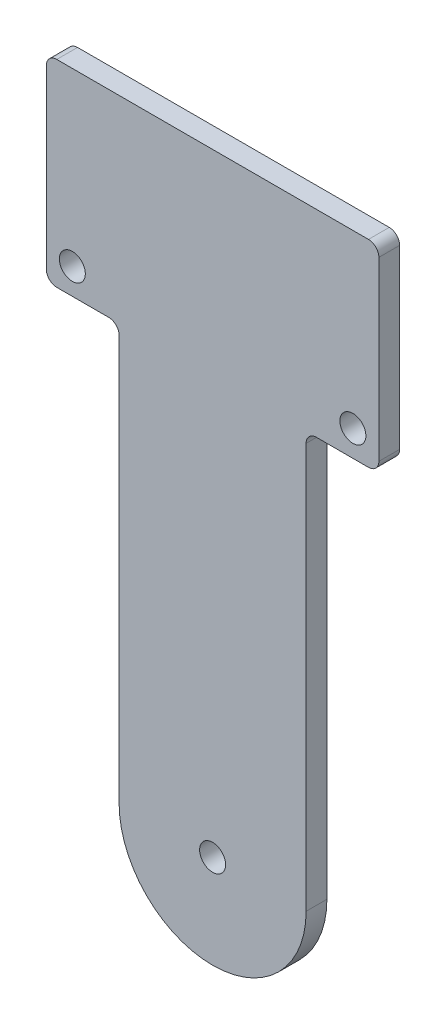
ISO-10303-21;
HEADER;
FILE_DESCRIPTION(('STEP AP214'),'2;1');
FILE_NAME('part.step','',(''),(''),'','','');
FILE_SCHEMA(('AUTOMOTIVE_DESIGN { 1 0 10303 214 1 1 1 1 }'));
ENDSEC;
DATA;
#1=APPLICATION_CONTEXT('core data for automotive mechanical design processes');
#2=APPLICATION_PROTOCOL_DEFINITION('international standard','automotive_design',2000,#1);
#3=PRODUCT_CONTEXT('',#1,'mechanical');
#4=PRODUCT('Part','Part','',(#3));
#5=PRODUCT_RELATED_PRODUCT_CATEGORY('part','',(#4));
#6=PRODUCT_DEFINITION_FORMATION('','',#4);
#7=PRODUCT_DEFINITION_CONTEXT('part definition',#1,'design');
#8=PRODUCT_DEFINITION('design','',#6,#7);
#9=PRODUCT_DEFINITION_SHAPE('','',#8);
#10=(LENGTH_UNIT() NAMED_UNIT(*) SI_UNIT(.MILLI.,.METRE.));
#11=(NAMED_UNIT(*) PLANE_ANGLE_UNIT() SI_UNIT($,.RADIAN.));
#12=(NAMED_UNIT(*) SI_UNIT($,.STERADIAN.) SOLID_ANGLE_UNIT());
#13=UNCERTAINTY_MEASURE_WITH_UNIT(LENGTH_MEASURE(1.E-05),#10,'distance_accuracy_value','');
#14=(GEOMETRIC_REPRESENTATION_CONTEXT(3) GLOBAL_UNCERTAINTY_ASSIGNED_CONTEXT((#13)) GLOBAL_UNIT_ASSIGNED_CONTEXT((#10,
#11,#12)) REPRESENTATION_CONTEXT('',''));
#15=CARTESIAN_POINT('',(0.,0.,0.));
#16=DIRECTION('',(0.,0.,1.));
#17=DIRECTION('',(1.,0.,0.));
#18=AXIS2_PLACEMENT_3D('',#15,#16,#17);
#19=CARTESIAN_POINT('',(0.,-20.404186251909,2.));
#20=DIRECTION('',(0.,-1.,0.));
#21=DIRECTION('',(0.,0.,-1.));
#22=AXIS2_PLACEMENT_3D('',#19,#20,#21);
#23=PLANE('',#22);
#24=DIRECTION('',(-1.,0.,0.));
#25=VECTOR('',#24,1.);
#26=CARTESIAN_POINT('',(0.,-20.404186251909,0.));
#27=LINE('',#26,#25);
#28=CARTESIAN_POINT('',(23.0486139328405,-20.404186251909,0.));
#29=VERTEX_POINT('',#28);
#30=CARTESIAN_POINT('',(18.0486139328405,-20.404186251909,0.));
#31=VERTEX_POINT('',#30);
#32=EDGE_CURVE('E174',#29,#31,#27,.T.);
#33=ORIENTED_EDGE('',*,*,#32,.F.);
#34=DIRECTION('',(0.,0.,-1.));
#35=VECTOR('',#34,1.);
#36=CARTESIAN_POINT('',(23.0486139328405,-20.404186251909,2.));
#37=LINE('',#36,#35);
#38=CARTESIAN_POINT('',(23.0486139328405,-20.404186251909,2.));
#39=VERTEX_POINT('',#38);
#40=EDGE_CURVE('E11',#39,#29,#37,.T.);
#41=ORIENTED_EDGE('',*,*,#40,.F.);
#42=DIRECTION('',(-1.,0.,0.));
#43=VECTOR('',#42,1.);
#44=CARTESIAN_POINT('',(0.,-20.404186251909,2.));
#45=LINE('',#44,#43);
#46=CARTESIAN_POINT('',(18.0486139328405,-20.404186251909,2.));
#47=VERTEX_POINT('',#46);
#48=EDGE_CURVE('E258',#39,#47,#45,.T.);
#49=ORIENTED_EDGE('',*,*,#48,.T.);
#50=DIRECTION('',(0.,0.,-1.));
#51=VECTOR('',#50,1.);
#52=CARTESIAN_POINT('',(18.0486139328405,-20.404186251909,2.));
#53=LINE('',#52,#51);
#54=EDGE_CURVE('E103',#47,#31,#53,.T.);
#55=ORIENTED_EDGE('',*,*,#54,.T.);
#56=EDGE_LOOP('',(#33,#41,#49,#55));
#57=FACE_BOUND('',#56,.T.);
#58=ADVANCED_FACE('F34',(#57),#23,.T.);
#59=CARTESIAN_POINT('',(23.0486139328405,-19.404186251909,2.));
#60=DIRECTION('',(0.,0.,-1.));
#61=DIRECTION('',(-1.,0.,0.));
#62=AXIS2_PLACEMENT_3D('',#59,#60,#61);
#63=CYLINDRICAL_SURFACE('',#62,1.);
#64=CARTESIAN_POINT('',(23.0486139328405,-19.404186251909,0.));
#65=DIRECTION('',(0.,0.,1.));
#66=DIRECTION('',(1.,0.,0.));
#67=AXIS2_PLACEMENT_3D('',#64,#65,#66);
#68=CIRCLE('',#67,1.);
#69=CARTESIAN_POINT('',(24.0486139328405,-19.404186251909,0.));
#70=VERTEX_POINT('',#69);
#71=EDGE_CURVE('E177',#29,#70,#68,.T.);
#72=ORIENTED_EDGE('',*,*,#71,.T.);
#73=DIRECTION('',(0.,0.,-1.));
#74=VECTOR('',#73,1.);
#75=CARTESIAN_POINT('',(24.0486139328405,-19.404186251909,2.));
#76=LINE('',#75,#74);
#77=CARTESIAN_POINT('',(24.0486139328405,-19.404186251909,2.));
#78=VERTEX_POINT('',#77);
#79=EDGE_CURVE('E43',#78,#70,#76,.T.);
#80=ORIENTED_EDGE('',*,*,#79,.F.);
#81=CARTESIAN_POINT('',(23.0486139328405,-19.404186251909,2.));
#82=DIRECTION('',(0.,0.,1.));
#83=DIRECTION('',(1.,0.,0.));
#84=AXIS2_PLACEMENT_3D('',#81,#82,#83);
#85=CIRCLE('',#84,1.);
#86=EDGE_CURVE('E254',#39,#78,#85,.T.);
#87=ORIENTED_EDGE('',*,*,#86,.F.);
#88=ORIENTED_EDGE('',*,*,#40,.T.);
#89=EDGE_LOOP('',(#72,#80,#87,#88));
#90=FACE_BOUND('',#89,.T.);
#91=ADVANCED_FACE('F242',(#90),#63,.T.);
#92=CARTESIAN_POINT('',(24.0486139328405,0.,2.));
#93=DIRECTION('',(1.,0.,0.));
#94=DIRECTION('',(0.,1.,0.));
#95=AXIS2_PLACEMENT_3D('',#92,#93,#94);
#96=PLANE('',#95);
#97=DIRECTION('',(0.,-1.,0.));
#98=VECTOR('',#97,1.);
#99=CARTESIAN_POINT('',(24.0486139328405,0.,0.));
#100=LINE('',#99,#98);
#101=CARTESIAN_POINT('',(24.0486139328405,-2.40418625190903,0.));
#102=VERTEX_POINT('',#101);
#103=EDGE_CURVE('E180',#102,#70,#100,.T.);
#104=ORIENTED_EDGE('',*,*,#103,.F.);
#105=DIRECTION('',(0.,0.,-1.));
#106=VECTOR('',#105,1.);
#107=CARTESIAN_POINT('',(24.0486139328405,-2.40418625190903,2.));
#108=LINE('',#107,#106);
#109=CARTESIAN_POINT('',(24.0486139328405,-2.40418625190903,2.));
#110=VERTEX_POINT('',#109);
#111=EDGE_CURVE('E232',#110,#102,#108,.T.);
#112=ORIENTED_EDGE('',*,*,#111,.F.);
#113=DIRECTION('',(0.,-1.,0.));
#114=VECTOR('',#113,1.);
#115=CARTESIAN_POINT('',(24.0486139328405,0.,2.));
#116=LINE('',#115,#114);
#117=EDGE_CURVE('E239',#110,#78,#116,.T.);
#118=ORIENTED_EDGE('',*,*,#117,.T.);
#119=ORIENTED_EDGE('',*,*,#79,.T.);
#120=EDGE_LOOP('',(#104,#112,#118,#119));
#121=FACE_BOUND('',#120,.T.);
#122=ADVANCED_FACE('F237',(#121),#96,.T.);
#123=CARTESIAN_POINT('',(23.0486139328405,-2.40418625190903,2.));
#124=DIRECTION('',(0.,0.,-1.));
#125=DIRECTION('',(-1.,0.,0.));
#126=AXIS2_PLACEMENT_3D('',#123,#124,#125);
#127=CYLINDRICAL_SURFACE('',#126,1.);
#128=CARTESIAN_POINT('',(23.0486139328405,-2.40418625190903,0.));
#129=DIRECTION('',(0.,0.,1.));
#130=DIRECTION('',(1.,0.,0.));
#131=AXIS2_PLACEMENT_3D('',#128,#129,#130);
#132=CIRCLE('',#131,1.);
#133=CARTESIAN_POINT('',(23.0486139328405,-1.40418625190903,0.));
#134=VERTEX_POINT('',#133);
#135=EDGE_CURVE('E183',#134,#102,#132,.F.);
#136=ORIENTED_EDGE('',*,*,#135,.F.);
#137=DIRECTION('',(0.,0.,-1.));
#138=VECTOR('',#137,1.);
#139=CARTESIAN_POINT('',(23.0486139328405,-1.40418625190903,2.));
#140=LINE('',#139,#138);
#141=CARTESIAN_POINT('',(23.0486139328405,-1.40418625190903,2.));
#142=VERTEX_POINT('',#141);
#143=EDGE_CURVE('E230',#142,#134,#140,.T.);
#144=ORIENTED_EDGE('',*,*,#143,.F.);
#145=CARTESIAN_POINT('',(23.0486139328405,-2.40418625190903,2.));
#146=DIRECTION('',(0.,0.,1.));
#147=DIRECTION('',(1.,0.,0.));
#148=AXIS2_PLACEMENT_3D('',#145,#146,#147);
#149=CIRCLE('',#148,1.);
#150=EDGE_CURVE('E252',#142,#110,#149,.F.);
#151=ORIENTED_EDGE('',*,*,#150,.T.);
#152=ORIENTED_EDGE('',*,*,#111,.T.);
#153=EDGE_LOOP('',(#136,#144,#151,#152));
#154=FACE_BOUND('',#153,.T.);
#155=ADVANCED_FACE('F248',(#154),#127,.T.);
#156=CARTESIAN_POINT('',(0.,-1.40418625190904,2.));
#157=DIRECTION('',(0.,-1.,0.));
#158=DIRECTION('',(1.,0.,0.));
#159=AXIS2_PLACEMENT_3D('',#156,#157,#158);
#160=PLANE('',#159);
#161=DIRECTION('',(-1.,0.,0.));
#162=VECTOR('',#161,1.);
#163=CARTESIAN_POINT('',(0.,-1.40418625190904,0.));
#164=LINE('',#163,#162);
#165=CARTESIAN_POINT('',(-6.95138606715951,-1.40418625190904,0.));
#166=VERTEX_POINT('',#165);
#167=EDGE_CURVE('E186',#134,#166,#164,.T.);
#168=ORIENTED_EDGE('',*,*,#167,.T.);
#169=DIRECTION('',(0.,0.,-1.));
#170=VECTOR('',#169,1.);
#171=CARTESIAN_POINT('',(-6.95138606715951,-1.40418625190904,2.));
#172=LINE('',#171,#170);
#173=CARTESIAN_POINT('',(-6.95138606715951,-1.40418625190904,2.));
#174=VERTEX_POINT('',#173);
#175=EDGE_CURVE('E227',#174,#166,#172,.T.);
#176=ORIENTED_EDGE('',*,*,#175,.F.);
#177=DIRECTION('',(-1.,0.,0.));
#178=VECTOR('',#177,1.);
#179=CARTESIAN_POINT('',(0.,-1.40418625190904,2.));
#180=LINE('',#179,#178);
#181=EDGE_CURVE('E256',#142,#174,#180,.T.);
#182=ORIENTED_EDGE('',*,*,#181,.F.);
#183=ORIENTED_EDGE('',*,*,#143,.T.);
#184=EDGE_LOOP('',(#168,#176,#182,#183));
#185=FACE_BOUND('',#184,.T.);
#186=ADVANCED_FACE('F359',(#185),#160,.F.);
#187=CARTESIAN_POINT('',(-6.95138606715951,-2.40418625190904,2.));
#188=DIRECTION('',(0.,0.,-1.));
#189=DIRECTION('',(-1.,0.,0.));
#190=AXIS2_PLACEMENT_3D('',#187,#188,#189);
#191=CYLINDRICAL_SURFACE('',#190,1.);
#192=CARTESIAN_POINT('',(-6.95138606715951,-2.40418625190904,0.));
#193=DIRECTION('',(0.,0.,1.));
#194=DIRECTION('',(1.,0.,0.));
#195=AXIS2_PLACEMENT_3D('',#192,#193,#194);
#196=CIRCLE('',#195,1.);
#197=CARTESIAN_POINT('',(-7.95138606715951,-2.40418625190904,0.));
#198=VERTEX_POINT('',#197);
#199=EDGE_CURVE('E189',#166,#198,#196,.T.);
#200=ORIENTED_EDGE('',*,*,#199,.T.);
#201=DIRECTION('',(0.,0.,-1.));
#202=VECTOR('',#201,1.);
#203=CARTESIAN_POINT('',(-7.95138606715951,-2.40418625190904,2.));
#204=LINE('',#203,#202);
#205=CARTESIAN_POINT('',(-7.95138606715951,-2.40418625190904,2.));
#206=VERTEX_POINT('',#205);
#207=EDGE_CURVE('E224',#206,#198,#204,.T.);
#208=ORIENTED_EDGE('',*,*,#207,.F.);
#209=CARTESIAN_POINT('',(-6.95138606715951,-2.40418625190904,2.));
#210=DIRECTION('',(0.,0.,1.));
#211=DIRECTION('',(1.,0.,0.));
#212=AXIS2_PLACEMENT_3D('',#209,#210,#211);
#213=CIRCLE('',#212,1.);
#214=EDGE_CURVE('E263',#174,#206,#213,.T.);
#215=ORIENTED_EDGE('',*,*,#214,.F.);
#216=ORIENTED_EDGE('',*,*,#175,.T.);
#217=EDGE_LOOP('',(#200,#208,#215,#216));
#218=FACE_BOUND('',#217,.T.);
#219=ADVANCED_FACE('F355',(#218),#191,.T.);
#220=CARTESIAN_POINT('',(-7.95138606715951,0.,2.));
#221=DIRECTION('',(1.,0.,0.));
#222=DIRECTION('',(0.,1.,0.));
#223=AXIS2_PLACEMENT_3D('',#220,#221,#222);
#224=PLANE('',#223);
#225=DIRECTION('',(0.,-1.,0.));
#226=VECTOR('',#225,1.);
#227=CARTESIAN_POINT('',(-7.95138606715951,0.,0.));
#228=LINE('',#227,#226);
#229=CARTESIAN_POINT('',(-7.95138606715951,-19.404186251909,0.));
#230=VERTEX_POINT('',#229);
#231=EDGE_CURVE('E192',#198,#230,#228,.T.);
#232=ORIENTED_EDGE('',*,*,#231,.T.);
#233=DIRECTION('',(0.,0.,-1.));
#234=VECTOR('',#233,1.);
#235=CARTESIAN_POINT('',(-7.95138606715951,-19.404186251909,2.));
#236=LINE('',#235,#234);
#237=CARTESIAN_POINT('',(-7.95138606715951,-19.404186251909,2.));
#238=VERTEX_POINT('',#237);
#239=EDGE_CURVE('E222',#238,#230,#236,.T.);
#240=ORIENTED_EDGE('',*,*,#239,.F.);
#241=DIRECTION('',(0.,-1.,0.));
#242=VECTOR('',#241,1.);
#243=CARTESIAN_POINT('',(-7.95138606715951,0.,2.));
#244=LINE('',#243,#242);
#245=EDGE_CURVE('E266',#206,#238,#244,.T.);
#246=ORIENTED_EDGE('',*,*,#245,.F.);
#247=ORIENTED_EDGE('',*,*,#207,.T.);
#248=EDGE_LOOP('',(#232,#240,#246,#247));
#249=FACE_BOUND('',#248,.T.);
#250=ADVANCED_FACE('F351',(#249),#224,.F.);
#251=CARTESIAN_POINT('',(-6.95138606715951,-19.404186251909,2.));
#252=DIRECTION('',(0.,0.,-1.));
#253=DIRECTION('',(-1.,0.,0.));
#254=AXIS2_PLACEMENT_3D('',#251,#252,#253);
#255=CYLINDRICAL_SURFACE('',#254,1.);
#256=CARTESIAN_POINT('',(-6.95138606715951,-19.404186251909,0.));
#257=DIRECTION('',(0.,0.,1.));
#258=DIRECTION('',(1.,0.,0.));
#259=AXIS2_PLACEMENT_3D('',#256,#257,#258);
#260=CIRCLE('',#259,1.);
#261=CARTESIAN_POINT('',(-6.9513860671595,-20.404186251909,0.));
#262=VERTEX_POINT('',#261);
#263=EDGE_CURVE('E195',#262,#230,#260,.F.);
#264=ORIENTED_EDGE('',*,*,#263,.F.);
#265=DIRECTION('',(0.,0.,-1.));
#266=VECTOR('',#265,1.);
#267=CARTESIAN_POINT('',(-6.9513860671595,-20.404186251909,2.));
#268=LINE('',#267,#266);
#269=CARTESIAN_POINT('',(-6.9513860671595,-20.404186251909,2.));
#270=VERTEX_POINT('',#269);
#271=EDGE_CURVE('E220',#270,#262,#268,.T.);
#272=ORIENTED_EDGE('',*,*,#271,.F.);
#273=CARTESIAN_POINT('',(-6.95138606715951,-19.404186251909,2.));
#274=DIRECTION('',(0.,0.,1.));
#275=DIRECTION('',(1.,0.,0.));
#276=AXIS2_PLACEMENT_3D('',#273,#274,#275);
#277=CIRCLE('',#276,1.);
#278=EDGE_CURVE('E268',#270,#238,#277,.F.);
#279=ORIENTED_EDGE('',*,*,#278,.T.);
#280=ORIENTED_EDGE('',*,*,#239,.T.);
#281=EDGE_LOOP('',(#264,#272,#279,#280));
#282=FACE_BOUND('',#281,.T.);
#283=ADVANCED_FACE('F347',(#282),#255,.T.);
#284=CARTESIAN_POINT('',(0.,-20.404186251909,2.));
#285=DIRECTION('',(0.,-1.,0.));
#286=DIRECTION('',(1.,0.,0.));
#287=AXIS2_PLACEMENT_3D('',#284,#285,#286);
#288=PLANE('',#287);
#289=DIRECTION('',(-1.,0.,0.));
#290=VECTOR('',#289,1.);
#291=CARTESIAN_POINT('',(0.,-20.404186251909,0.));
#292=LINE('',#291,#290);
#293=CARTESIAN_POINT('',(-1.95138606715951,-20.404186251909,0.));
#294=VERTEX_POINT('',#293);
#295=EDGE_CURVE('E198',#294,#262,#292,.T.);
#296=ORIENTED_EDGE('',*,*,#295,.F.);
#297=DIRECTION('',(0.,0.,-1.));
#298=VECTOR('',#297,1.);
#299=CARTESIAN_POINT('',(-1.95138606715951,-20.404186251909,2.));
#300=LINE('',#299,#298);
#301=CARTESIAN_POINT('',(-1.95138606715951,-20.404186251909,2.));
#302=VERTEX_POINT('',#301);
#303=EDGE_CURVE('E218',#302,#294,#300,.T.);
#304=ORIENTED_EDGE('',*,*,#303,.F.);
#305=DIRECTION('',(-1.,0.,0.));
#306=VECTOR('',#305,1.);
#307=CARTESIAN_POINT('',(0.,-20.404186251909,2.));
#308=LINE('',#307,#306);
#309=EDGE_CURVE('E271',#302,#270,#308,.T.);
#310=ORIENTED_EDGE('',*,*,#309,.T.);
#311=ORIENTED_EDGE('',*,*,#271,.T.);
#312=EDGE_LOOP('',(#296,#304,#310,#311));
#313=FACE_BOUND('',#312,.T.);
#314=ADVANCED_FACE('F343',(#313),#288,.T.);
#315=CARTESIAN_POINT('',(-1.9513860671595,-21.404186251909,2.));
#316=DIRECTION('',(0.,0.,-1.));
#317=DIRECTION('',(-1.,0.,0.));
#318=AXIS2_PLACEMENT_3D('',#315,#316,#317);
#319=CYLINDRICAL_SURFACE('',#318,1.);
#320=CARTESIAN_POINT('',(-1.9513860671595,-21.404186251909,0.));
#321=DIRECTION('',(0.,0.,1.));
#322=DIRECTION('',(1.,0.,0.));
#323=AXIS2_PLACEMENT_3D('',#320,#321,#322);
#324=CIRCLE('',#323,1.);
#325=CARTESIAN_POINT('',(-0.951386067159499,-21.404186251909,0.));
#326=VERTEX_POINT('',#325);
#327=EDGE_CURVE('E201',#326,#294,#324,.T.);
#328=ORIENTED_EDGE('',*,*,#327,.F.);
#329=DIRECTION('',(0.,0.,-1.));
#330=VECTOR('',#329,1.);
#331=CARTESIAN_POINT('',(-0.951386067159499,-21.404186251909,2.));
#332=LINE('',#331,#330);
#333=CARTESIAN_POINT('',(-0.951386067159499,-21.404186251909,2.));
#334=VERTEX_POINT('',#333);
#335=EDGE_CURVE('E216',#334,#326,#332,.T.);
#336=ORIENTED_EDGE('',*,*,#335,.F.);
#337=CARTESIAN_POINT('',(-1.9513860671595,-21.404186251909,2.));
#338=DIRECTION('',(0.,0.,1.));
#339=DIRECTION('',(1.,0.,0.));
#340=AXIS2_PLACEMENT_3D('',#337,#338,#339);
#341=CIRCLE('',#340,1.);
#342=EDGE_CURVE('E274',#334,#302,#341,.T.);
#343=ORIENTED_EDGE('',*,*,#342,.T.);
#344=ORIENTED_EDGE('',*,*,#303,.T.);
#345=EDGE_LOOP('',(#328,#336,#343,#344));
#346=FACE_BOUND('',#345,.T.);
#347=ADVANCED_FACE('F340',(#346),#319,.F.);
#348=CARTESIAN_POINT('',(-0.951386067159499,0.,2.));
#349=DIRECTION('',(-1.,0.,0.));
#350=DIRECTION('',(0.,0.,1.));
#351=AXIS2_PLACEMENT_3D('',#348,#349,#350);
#352=PLANE('',#351);
#353=DIRECTION('',(0.,1.,0.));
#354=VECTOR('',#353,1.);
#355=CARTESIAN_POINT('',(-0.951386067159499,0.,0.));
#356=LINE('',#355,#354);
#357=CARTESIAN_POINT('',(-0.951386067159499,-60.404186251909,0.));
#358=VERTEX_POINT('',#357);
#359=EDGE_CURVE('E204',#358,#326,#356,.T.);
#360=ORIENTED_EDGE('',*,*,#359,.F.);
#361=DIRECTION('',(0.,0.,-1.));
#362=VECTOR('',#361,1.);
#363=CARTESIAN_POINT('',(-0.951386067159499,-60.404186251909,2.));
#364=LINE('',#363,#362);
#365=CARTESIAN_POINT('',(-0.951386067159499,-60.404186251909,2.));
#366=VERTEX_POINT('',#365);
#367=EDGE_CURVE('E151',#366,#358,#364,.T.);
#368=ORIENTED_EDGE('',*,*,#367,.F.);
#369=DIRECTION('',(0.,1.,0.));
#370=VECTOR('',#369,1.);
#371=CARTESIAN_POINT('',(-0.951386067159499,0.,2.));
#372=LINE('',#371,#370);
#373=EDGE_CURVE('E158',#366,#334,#372,.T.);
#374=ORIENTED_EDGE('',*,*,#373,.T.);
#375=ORIENTED_EDGE('',*,*,#335,.T.);
#376=EDGE_LOOP('',(#360,#368,#374,#375));
#377=FACE_BOUND('',#376,.T.);
#378=ADVANCED_FACE('F278',(#377),#352,.T.);
#379=CARTESIAN_POINT('',(8.0486139328405,-60.404186251909,2.));
#380=DIRECTION('',(0.,0.,-1.));
#381=DIRECTION('',(-1.,0.,0.));
#382=AXIS2_PLACEMENT_3D('',#379,#380,#381);
#383=CYLINDRICAL_SURFACE('',#382,9.);
#384=CARTESIAN_POINT('',(8.0486139328405,-60.404186251909,0.));
#385=DIRECTION('',(0.,0.,1.));
#386=DIRECTION('',(1.,0.,0.));
#387=AXIS2_PLACEMENT_3D('',#384,#385,#386);
#388=CIRCLE('',#387,9.);
#389=CARTESIAN_POINT('',(17.0486139328405,-60.404186251909,0.));
#390=VERTEX_POINT('',#389);
#391=EDGE_CURVE('E146',#390,#358,#388,.F.);
#392=ORIENTED_EDGE('',*,*,#391,.F.);
#393=DIRECTION('',(0.,0.,-1.));
#394=VECTOR('',#393,1.);
#395=CARTESIAN_POINT('',(17.0486139328405,-60.404186251909,2.));
#396=LINE('',#395,#394);
#397=CARTESIAN_POINT('',(17.0486139328405,-60.404186251909,2.));
#398=VERTEX_POINT('',#397);
#399=EDGE_CURVE('E141',#398,#390,#396,.T.);
#400=ORIENTED_EDGE('',*,*,#399,.F.);
#401=CARTESIAN_POINT('',(8.0486139328405,-60.404186251909,2.));
#402=DIRECTION('',(0.,0.,1.));
#403=DIRECTION('',(1.,0.,0.));
#404=AXIS2_PLACEMENT_3D('',#401,#402,#403);
#405=CIRCLE('',#404,9.);
#406=EDGE_CURVE('E144',#398,#366,#405,.F.);
#407=ORIENTED_EDGE('',*,*,#406,.T.);
#408=ORIENTED_EDGE('',*,*,#367,.T.);
#409=EDGE_LOOP('',(#392,#400,#407,#408));
#410=FACE_BOUND('',#409,.T.);
#411=ADVANCED_FACE('F143',(#410),#383,.T.);
#412=CARTESIAN_POINT('',(17.0486139328405,0.,2.));
#413=DIRECTION('',(1.,0.,0.));
#414=DIRECTION('',(0.,0.,-1.));
#415=AXIS2_PLACEMENT_3D('',#412,#413,#414);
#416=PLANE('',#415);
#417=DIRECTION('',(0.,-1.,0.));
#418=VECTOR('',#417,1.);
#419=CARTESIAN_POINT('',(17.0486139328405,0.,0.));
#420=LINE('',#419,#418);
#421=CARTESIAN_POINT('',(17.0486139328405,-21.404186251909,0.));
#422=VERTEX_POINT('',#421);
#423=EDGE_CURVE('E208',#422,#390,#420,.T.);
#424=ORIENTED_EDGE('',*,*,#423,.F.);
#425=DIRECTION('',(0.,0.,-1.));
#426=VECTOR('',#425,1.);
#427=CARTESIAN_POINT('',(17.0486139328405,-21.404186251909,2.));
#428=LINE('',#427,#426);
#429=CARTESIAN_POINT('',(17.0486139328405,-21.404186251909,2.));
#430=VERTEX_POINT('',#429);
#431=EDGE_CURVE('E96',#430,#422,#428,.T.);
#432=ORIENTED_EDGE('',*,*,#431,.F.);
#433=DIRECTION('',(0.,-1.,0.));
#434=VECTOR('',#433,1.);
#435=CARTESIAN_POINT('',(17.0486139328405,0.,2.));
#436=LINE('',#435,#434);
#437=EDGE_CURVE('E155',#430,#398,#436,.T.);
#438=ORIENTED_EDGE('',*,*,#437,.T.);
#439=ORIENTED_EDGE('',*,*,#399,.T.);
#440=EDGE_LOOP('',(#424,#432,#438,#439));
#441=FACE_BOUND('',#440,.T.);
#442=ADVANCED_FACE('F160',(#441),#416,.T.);
#443=CARTESIAN_POINT('',(21.5486139328405,-17.904186251909,2.));
#444=DIRECTION('',(0.,0.,-1.));
#445=DIRECTION('',(-1.,0.,0.));
#446=AXIS2_PLACEMENT_3D('',#443,#444,#445);
#447=CYLINDRICAL_SURFACE('',#446,1.25);
#448=CARTESIAN_POINT('',(21.5486139328405,-17.904186251909,2.));
#449=DIRECTION('',(0.,0.,1.));
#450=DIRECTION('',(1.,0.,0.));
#451=AXIS2_PLACEMENT_3D('',#448,#449,#450);
#452=CIRCLE('',#451,1.25);
#453=CARTESIAN_POINT('',(22.7986139328405,-17.904186251909,2.));
#454=VERTEX_POINT('',#453);
#455=EDGE_CURVE('E281',#454,#454,#452,.T.);
#456=ORIENTED_EDGE('',*,*,#455,.T.);
#457=EDGE_LOOP('',(#456));
#458=FACE_BOUND('',#457,.T.);
#459=CARTESIAN_POINT('',(21.5486139328405,-17.904186251909,0.));
#460=DIRECTION('',(0.,0.,1.));
#461=DIRECTION('',(1.,0.,0.));
#462=AXIS2_PLACEMENT_3D('',#459,#460,#461);
#463=CIRCLE('',#462,1.25);
#464=CARTESIAN_POINT('',(22.7986139328405,-17.904186251909,0.));
#465=VERTEX_POINT('',#464);
#466=EDGE_CURVE('E171',#465,#465,#463,.T.);
#467=ORIENTED_EDGE('',*,*,#466,.F.);
#468=EDGE_LOOP('',(#467));
#469=FACE_BOUND('',#468,.T.);
#470=ADVANCED_FACE('F300',(#458,#469),#447,.F.);
#471=CARTESIAN_POINT('',(-5.4513860671595,-17.904186251909,2.));
#472=DIRECTION('',(0.,0.,-1.));
#473=DIRECTION('',(-1.,0.,0.));
#474=AXIS2_PLACEMENT_3D('',#471,#472,#473);
#475=CYLINDRICAL_SURFACE('',#474,1.25);
#476=CARTESIAN_POINT('',(-5.4513860671595,-17.904186251909,2.));
#477=DIRECTION('',(0.,0.,1.));
#478=DIRECTION('',(1.,0.,0.));
#479=AXIS2_PLACEMENT_3D('',#476,#477,#478);
#480=CIRCLE('',#479,1.25);
#481=CARTESIAN_POINT('',(-4.2013860671595,-17.904186251909,2.));
#482=VERTEX_POINT('',#481);
#483=EDGE_CURVE('E283',#482,#482,#480,.T.);
#484=ORIENTED_EDGE('',*,*,#483,.T.);
#485=EDGE_LOOP('',(#484));
#486=FACE_BOUND('',#485,.T.);
#487=CARTESIAN_POINT('',(-5.4513860671595,-17.904186251909,0.));
#488=DIRECTION('',(0.,0.,1.));
#489=DIRECTION('',(1.,0.,0.));
#490=AXIS2_PLACEMENT_3D('',#487,#488,#489);
#491=CIRCLE('',#490,1.25);
#492=CARTESIAN_POINT('',(-4.2013860671595,-17.904186251909,0.));
#493=VERTEX_POINT('',#492);
#494=EDGE_CURVE('E168',#493,#493,#491,.T.);
#495=ORIENTED_EDGE('',*,*,#494,.F.);
#496=EDGE_LOOP('',(#495));
#497=FACE_BOUND('',#496,.T.);
#498=ADVANCED_FACE('F303',(#486,#497),#475,.F.);
#499=CARTESIAN_POINT('',(8.0486139328405,-60.404186251909,2.));
#500=DIRECTION('',(0.,0.,-1.));
#501=DIRECTION('',(-1.,0.,0.));
#502=AXIS2_PLACEMENT_3D('',#499,#500,#501);
#503=CYLINDRICAL_SURFACE('',#502,1.25);
#504=CARTESIAN_POINT('',(8.0486139328405,-60.404186251909,2.));
#505=DIRECTION('',(0.,0.,1.));
#506=DIRECTION('',(1.,0.,0.));
#507=AXIS2_PLACEMENT_3D('',#504,#505,#506);
#508=CIRCLE('',#507,1.25);
#509=CARTESIAN_POINT('',(9.2986139328405,-60.404186251909,2.));
#510=VERTEX_POINT('',#509);
#511=EDGE_CURVE('E212',#510,#510,#508,.T.);
#512=ORIENTED_EDGE('',*,*,#511,.T.);
#513=EDGE_LOOP('',(#512));
#514=FACE_BOUND('',#513,.T.);
#515=CARTESIAN_POINT('',(8.0486139328405,-60.404186251909,0.));
#516=DIRECTION('',(0.,0.,1.));
#517=DIRECTION('',(1.,0.,0.));
#518=AXIS2_PLACEMENT_3D('',#515,#516,#517);
#519=CIRCLE('',#518,1.25);
#520=CARTESIAN_POINT('',(9.2986139328405,-60.404186251909,0.));
#521=VERTEX_POINT('',#520);
#522=EDGE_CURVE('E165',#521,#521,#519,.T.);
#523=ORIENTED_EDGE('',*,*,#522,.F.);
#524=EDGE_LOOP('',(#523));
#525=FACE_BOUND('',#524,.T.);
#526=ADVANCED_FACE('F36',(#514,#525),#503,.F.);
#527=CARTESIAN_POINT('',(18.0486139328405,-21.404186251909,2.));
#528=DIRECTION('',(0.,0.,-1.));
#529=DIRECTION('',(-1.,0.,0.));
#530=AXIS2_PLACEMENT_3D('',#527,#528,#529);
#531=CYLINDRICAL_SURFACE('',#530,1.);
#532=CARTESIAN_POINT('',(18.0486139328405,-21.404186251909,0.));
#533=DIRECTION('',(0.,0.,1.));
#534=DIRECTION('',(1.,0.,0.));
#535=AXIS2_PLACEMENT_3D('',#532,#533,#534);
#536=CIRCLE('',#535,1.);
#537=EDGE_CURVE('E210',#422,#31,#536,.F.);
#538=ORIENTED_EDGE('',*,*,#537,.T.);
#539=ORIENTED_EDGE('',*,*,#54,.F.);
#540=CARTESIAN_POINT('',(18.0486139328405,-21.404186251909,2.));
#541=DIRECTION('',(0.,0.,1.));
#542=DIRECTION('',(1.,0.,0.));
#543=AXIS2_PLACEMENT_3D('',#540,#541,#542);
#544=CIRCLE('',#543,1.);
#545=EDGE_CURVE('E51',#430,#47,#544,.F.);
#546=ORIENTED_EDGE('',*,*,#545,.F.);
#547=ORIENTED_EDGE('',*,*,#431,.T.);
#548=EDGE_LOOP('',(#538,#539,#546,#547));
#549=FACE_BOUND('',#548,.T.);
#550=ADVANCED_FACE('F280',(#549),#531,.F.);
#551=CARTESIAN_POINT('',(0.,0.,2.));
#552=DIRECTION('',(0.,0.,1.));
#553=DIRECTION('',(1.,0.,0.));
#554=AXIS2_PLACEMENT_3D('',#551,#552,#553);
#555=PLANE('',#554);
#556=ORIENTED_EDGE('',*,*,#511,.F.);
#557=EDGE_LOOP('',(#556));
#558=FACE_BOUND('',#557,.T.);
#559=ORIENTED_EDGE('',*,*,#483,.F.);
#560=EDGE_LOOP('',(#559));
#561=FACE_BOUND('',#560,.T.);
#562=ORIENTED_EDGE('',*,*,#455,.F.);
#563=EDGE_LOOP('',(#562));
#564=FACE_BOUND('',#563,.T.);
#565=ORIENTED_EDGE('',*,*,#48,.F.);
#566=ORIENTED_EDGE('',*,*,#86,.T.);
#567=ORIENTED_EDGE('',*,*,#117,.F.);
#568=ORIENTED_EDGE('',*,*,#150,.F.);
#569=ORIENTED_EDGE('',*,*,#181,.T.);
#570=ORIENTED_EDGE('',*,*,#214,.T.);
#571=ORIENTED_EDGE('',*,*,#245,.T.);
#572=ORIENTED_EDGE('',*,*,#278,.F.);
#573=ORIENTED_EDGE('',*,*,#309,.F.);
#574=ORIENTED_EDGE('',*,*,#342,.F.);
#575=ORIENTED_EDGE('',*,*,#373,.F.);
#576=ORIENTED_EDGE('',*,*,#406,.F.);
#577=ORIENTED_EDGE('',*,*,#437,.F.);
#578=ORIENTED_EDGE('',*,*,#545,.T.);
#579=EDGE_LOOP('',(#565,#566,#567,#568,#569,#570,#571,#572,#573,#574,#575,#576,#577,#578));
#580=FACE_BOUND('',#579,.T.);
#581=ADVANCED_FACE('F154',(#558,#561,#564,#580),#555,.T.);
#582=CARTESIAN_POINT('',(0.,0.,0.));
#583=DIRECTION('',(0.,0.,1.));
#584=DIRECTION('',(1.,0.,0.));
#585=AXIS2_PLACEMENT_3D('',#582,#583,#584);
#586=PLANE('',#585);
#587=ORIENTED_EDGE('',*,*,#522,.T.);
#588=EDGE_LOOP('',(#587));
#589=FACE_BOUND('',#588,.T.);
#590=ORIENTED_EDGE('',*,*,#494,.T.);
#591=EDGE_LOOP('',(#590));
#592=FACE_BOUND('',#591,.T.);
#593=ORIENTED_EDGE('',*,*,#466,.T.);
#594=EDGE_LOOP('',(#593));
#595=FACE_BOUND('',#594,.T.);
#596=ORIENTED_EDGE('',*,*,#32,.T.);
#597=ORIENTED_EDGE('',*,*,#537,.F.);
#598=ORIENTED_EDGE('',*,*,#423,.T.);
#599=ORIENTED_EDGE('',*,*,#391,.T.);
#600=ORIENTED_EDGE('',*,*,#359,.T.);
#601=ORIENTED_EDGE('',*,*,#327,.T.);
#602=ORIENTED_EDGE('',*,*,#295,.T.);
#603=ORIENTED_EDGE('',*,*,#263,.T.);
#604=ORIENTED_EDGE('',*,*,#231,.F.);
#605=ORIENTED_EDGE('',*,*,#199,.F.);
#606=ORIENTED_EDGE('',*,*,#167,.F.);
#607=ORIENTED_EDGE('',*,*,#135,.T.);
#608=ORIENTED_EDGE('',*,*,#103,.T.);
#609=ORIENTED_EDGE('',*,*,#71,.F.);
#610=EDGE_LOOP('',(#596,#597,#598,#599,#600,#601,#602,#603,#604,#605,#606,#607,#608,#609));
#611=FACE_BOUND('',#610,.T.);
#612=ADVANCED_FACE('F244',(#589,#592,#595,#611),#586,.F.);
#613=CLOSED_SHELL('',(#58,#91,#122,#155,#186,#219,#250,#283,#314,#347,#378,#411,#442,#470,#498,
#526,#550,#581,#612));
#614=MANIFOLD_SOLID_BREP('B2',#613);
#615=ADVANCED_BREP_SHAPE_REPRESENTATION('',(#18,#614),#14);
#616=SHAPE_DEFINITION_REPRESENTATION(#9,#615);
ENDSEC;
END-ISO-10303-21;
